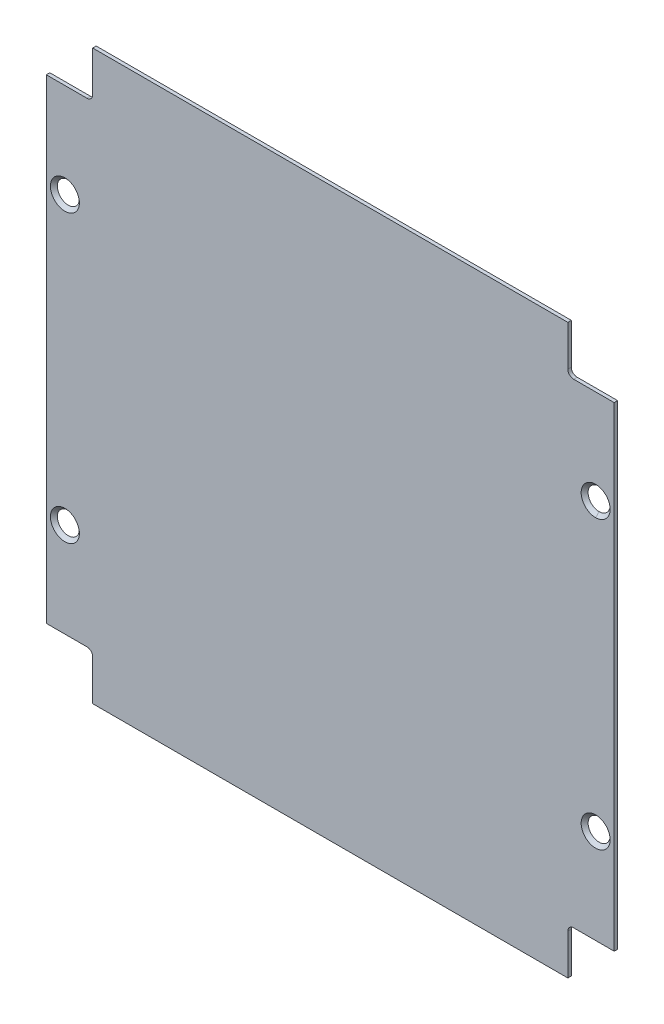
ISO-10303-21;
HEADER;
FILE_DESCRIPTION(('STEP AP214'),'2;1');
FILE_NAME('part.step','',(''),(''),'','','');
FILE_SCHEMA(('AUTOMOTIVE_DESIGN { 1 0 10303 214 1 1 1 1 }'));
ENDSEC;
DATA;
#1=APPLICATION_CONTEXT('core data for automotive mechanical design processes');
#2=APPLICATION_PROTOCOL_DEFINITION('international standard','automotive_design',2000,#1);
#3=PRODUCT_CONTEXT('',#1,'mechanical');
#4=PRODUCT('Part','Part','',(#3));
#5=PRODUCT_RELATED_PRODUCT_CATEGORY('part','',(#4));
#6=PRODUCT_DEFINITION_FORMATION('','',#4);
#7=PRODUCT_DEFINITION_CONTEXT('part definition',#1,'design');
#8=PRODUCT_DEFINITION('design','',#6,#7);
#9=PRODUCT_DEFINITION_SHAPE('','',#8);
#10=(LENGTH_UNIT() NAMED_UNIT(*) SI_UNIT(.MILLI.,.METRE.));
#11=(NAMED_UNIT(*) PLANE_ANGLE_UNIT() SI_UNIT($,.RADIAN.));
#12=(NAMED_UNIT(*) SI_UNIT($,.STERADIAN.) SOLID_ANGLE_UNIT());
#13=UNCERTAINTY_MEASURE_WITH_UNIT(LENGTH_MEASURE(1.E-05),#10,'distance_accuracy_value','');
#14=(GEOMETRIC_REPRESENTATION_CONTEXT(3) GLOBAL_UNCERTAINTY_ASSIGNED_CONTEXT((#13)) GLOBAL_UNIT_ASSIGNED_CONTEXT((#10,
#11,#12)) REPRESENTATION_CONTEXT('',''));
#15=CARTESIAN_POINT('',(0.,0.,0.));
#16=DIRECTION('',(0.,0.,1.));
#17=DIRECTION('',(1.,0.,0.));
#18=AXIS2_PLACEMENT_3D('',#15,#16,#17);
#19=CARTESIAN_POINT('',(50.,-50.,220.05));
#20=DIRECTION('',(0.,0.,1.));
#21=DIRECTION('',(1.,0.,0.));
#22=AXIS2_PLACEMENT_3D('',#19,#20,#21);
#23=PLANE('',#22);
#24=CARTESIAN_POINT('',(4.2,-25.3,220.05));
#25=DIRECTION('',(0.,0.,1.));
#26=DIRECTION('',(1.,0.,0.));
#27=AXIS2_PLACEMENT_3D('',#24,#25,#26);
#28=CIRCLE('',#27,2.50000738707188);
#29=CARTESIAN_POINT('',(6.70000738707188,-25.3,220.05));
#30=VERTEX_POINT('',#29);
#31=EDGE_CURVE('E171',#30,#30,#28,.F.);
#32=ORIENTED_EDGE('',*,*,#31,.T.);
#33=EDGE_LOOP('',(#32));
#34=FACE_BOUND('',#33,.T.);
#35=CARTESIAN_POINT('',(95.8,-25.3,220.05));
#36=DIRECTION('',(0.,0.,1.));
#37=DIRECTION('',(1.,0.,0.));
#38=AXIS2_PLACEMENT_3D('',#35,#36,#37);
#39=CIRCLE('',#38,2.50000738709999);
#40=CARTESIAN_POINT('',(95.8,-22.8000039421432,220.049994335381));
#41=VERTEX_POINT('',#40);
#42=CARTESIAN_POINT('',(95.8,-27.799996057862,220.049994335381));
#43=VERTEX_POINT('',#42);
#44=EDGE_CURVE('E182',#41,#43,#39,.F.);
#45=ORIENTED_EDGE('',*,*,#44,.T.);
#46=CARTESIAN_POINT('',(95.8,-25.3,220.05));
#47=DIRECTION('',(0.,0.,1.));
#48=DIRECTION('',(1.,0.,0.));
#49=AXIS2_PLACEMENT_3D('',#46,#47,#48);
#50=CIRCLE('',#49,2.50000738709999);
#51=EDGE_CURVE('E339',#43,#41,#50,.F.);
#52=ORIENTED_EDGE('',*,*,#51,.T.);
#53=EDGE_LOOP('',(#45,#52));
#54=FACE_BOUND('',#53,.T.);
#55=CARTESIAN_POINT('',(95.8,-74.7,220.05));
#56=DIRECTION('',(0.,0.,1.));
#57=DIRECTION('',(1.,0.,0.));
#58=AXIS2_PLACEMENT_3D('',#55,#56,#57);
#59=CIRCLE('',#58,2.50000738709999);
#60=CARTESIAN_POINT('',(98.3000073871,-74.7,220.05));
#61=VERTEX_POINT('',#60);
#62=EDGE_CURVE('E344',#61,#61,#59,.F.);
#63=ORIENTED_EDGE('',*,*,#62,.T.);
#64=EDGE_LOOP('',(#63));
#65=FACE_BOUND('',#64,.T.);
#66=CARTESIAN_POINT('',(4.2,-74.7,220.05));
#67=DIRECTION('',(0.,0.,1.));
#68=DIRECTION('',(1.,0.,0.));
#69=AXIS2_PLACEMENT_3D('',#66,#67,#68);
#70=CIRCLE('',#69,2.50000738707188);
#71=CARTESIAN_POINT('',(6.70000738707188,-74.7,220.05));
#72=VERTEX_POINT('',#71);
#73=EDGE_CURVE('E190',#72,#72,#70,.F.);
#74=ORIENTED_EDGE('',*,*,#73,.T.);
#75=EDGE_LOOP('',(#74));
#76=FACE_BOUND('',#75,.T.);
#77=DIRECTION('',(0.,1.,0.));
#78=VECTOR('',#77,1.);
#79=CARTESIAN_POINT('',(9.,-4.5,220.05));
#80=LINE('',#79,#78);
#81=CARTESIAN_POINT('',(9.,-1.,220.05));
#82=VERTEX_POINT('',#81);
#83=CARTESIAN_POINT('',(9.,-8.,220.05));
#84=VERTEX_POINT('',#83);
#85=EDGE_CURVE('E191',#82,#84,#80,.F.);
#86=ORIENTED_EDGE('',*,*,#85,.T.);
#87=CARTESIAN_POINT('',(8.,-8.,220.05));
#88=DIRECTION('',(0.,0.,1.));
#89=DIRECTION('',(1.,0.,0.));
#90=AXIS2_PLACEMENT_3D('',#87,#88,#89);
#91=CIRCLE('',#90,1.);
#92=CARTESIAN_POINT('',(8.,-9.,220.05));
#93=VERTEX_POINT('',#92);
#94=EDGE_CURVE('E20',#84,#93,#91,.F.);
#95=ORIENTED_EDGE('',*,*,#94,.T.);
#96=DIRECTION('',(1.,0.,0.));
#97=VECTOR('',#96,1.);
#98=CARTESIAN_POINT('',(4.5,-9.,220.05));
#99=LINE('',#98,#97);
#100=CARTESIAN_POINT('',(1.,-9.,220.05));
#101=VERTEX_POINT('',#100);
#102=EDGE_CURVE('E277',#101,#93,#99,.T.);
#103=ORIENTED_EDGE('',*,*,#102,.F.);
#104=DIRECTION('',(0.,1.,0.));
#105=VECTOR('',#104,1.);
#106=CARTESIAN_POINT('',(1.,-50.,220.05));
#107=LINE('',#106,#105);
#108=CARTESIAN_POINT('',(1.,-91.,220.05));
#109=VERTEX_POINT('',#108);
#110=EDGE_CURVE('E151',#101,#109,#107,.F.);
#111=ORIENTED_EDGE('',*,*,#110,.T.);
#112=DIRECTION('',(1.,0.,0.));
#113=VECTOR('',#112,1.);
#114=CARTESIAN_POINT('',(4.5,-91.,220.05));
#115=LINE('',#114,#113);
#116=CARTESIAN_POINT('',(8.,-91.,220.05));
#117=VERTEX_POINT('',#116);
#118=EDGE_CURVE('E267',#109,#117,#115,.T.);
#119=ORIENTED_EDGE('',*,*,#118,.T.);
#120=CARTESIAN_POINT('',(8.,-92.,220.05));
#121=DIRECTION('',(0.,0.,1.));
#122=DIRECTION('',(1.,0.,0.));
#123=AXIS2_PLACEMENT_3D('',#120,#121,#122);
#124=CIRCLE('',#123,1.);
#125=CARTESIAN_POINT('',(9.,-92.,220.05));
#126=VERTEX_POINT('',#125);
#127=EDGE_CURVE('E263',#117,#126,#124,.F.);
#128=ORIENTED_EDGE('',*,*,#127,.T.);
#129=DIRECTION('',(0.,1.,0.));
#130=VECTOR('',#129,1.);
#131=CARTESIAN_POINT('',(9.,-95.5,220.05));
#132=LINE('',#131,#130);
#133=CARTESIAN_POINT('',(9.,-99.,220.05));
#134=VERTEX_POINT('',#133);
#135=EDGE_CURVE('E257',#126,#134,#132,.F.);
#136=ORIENTED_EDGE('',*,*,#135,.T.);
#137=DIRECTION('',(1.,0.,0.));
#138=VECTOR('',#137,1.);
#139=CARTESIAN_POINT('',(50.,-99.,220.05));
#140=LINE('',#139,#138);
#141=CARTESIAN_POINT('',(91.,-99.,220.05));
#142=VERTEX_POINT('',#141);
#143=EDGE_CURVE('E256',#134,#142,#140,.T.);
#144=ORIENTED_EDGE('',*,*,#143,.T.);
#145=DIRECTION('',(0.,1.,0.));
#146=VECTOR('',#145,1.);
#147=CARTESIAN_POINT('',(91.,-95.5,220.05));
#148=LINE('',#147,#146);
#149=CARTESIAN_POINT('',(91.,-92.,220.05));
#150=VERTEX_POINT('',#149);
#151=EDGE_CURVE('E243',#150,#142,#148,.F.);
#152=ORIENTED_EDGE('',*,*,#151,.F.);
#153=CARTESIAN_POINT('',(92.,-92.,220.05));
#154=DIRECTION('',(0.,0.,1.));
#155=DIRECTION('',(1.,0.,0.));
#156=AXIS2_PLACEMENT_3D('',#153,#154,#155);
#157=CIRCLE('',#156,1.);
#158=CARTESIAN_POINT('',(92.,-91.,220.05));
#159=VERTEX_POINT('',#158);
#160=EDGE_CURVE('E237',#150,#159,#157,.F.);
#161=ORIENTED_EDGE('',*,*,#160,.T.);
#162=DIRECTION('',(1.,0.,0.));
#163=VECTOR('',#162,1.);
#164=CARTESIAN_POINT('',(95.5,-91.,220.05));
#165=LINE('',#164,#163);
#166=CARTESIAN_POINT('',(99.,-91.,220.05));
#167=VERTEX_POINT('',#166);
#168=EDGE_CURVE('E236',#159,#167,#165,.T.);
#169=ORIENTED_EDGE('',*,*,#168,.T.);
#170=DIRECTION('',(0.,1.,0.));
#171=VECTOR('',#170,1.);
#172=CARTESIAN_POINT('',(99.,-50.,220.05));
#173=LINE('',#172,#171);
#174=CARTESIAN_POINT('',(99.,-9.,220.05));
#175=VERTEX_POINT('',#174);
#176=EDGE_CURVE('E230',#175,#167,#173,.F.);
#177=ORIENTED_EDGE('',*,*,#176,.F.);
#178=DIRECTION('',(1.,0.,0.));
#179=VECTOR('',#178,1.);
#180=CARTESIAN_POINT('',(95.5,-9.,220.05));
#181=LINE('',#180,#179);
#182=CARTESIAN_POINT('',(92.,-9.,220.05));
#183=VERTEX_POINT('',#182);
#184=EDGE_CURVE('E218',#183,#175,#181,.T.);
#185=ORIENTED_EDGE('',*,*,#184,.F.);
#186=CARTESIAN_POINT('',(92.,-8.,220.05));
#187=DIRECTION('',(0.,0.,1.));
#188=DIRECTION('',(1.,0.,0.));
#189=AXIS2_PLACEMENT_3D('',#186,#187,#188);
#190=CIRCLE('',#189,1.);
#191=CARTESIAN_POINT('',(91.,-8.,220.05));
#192=VERTEX_POINT('',#191);
#193=EDGE_CURVE('E215',#183,#192,#190,.F.);
#194=ORIENTED_EDGE('',*,*,#193,.T.);
#195=DIRECTION('',(0.,1.,0.));
#196=VECTOR('',#195,1.);
#197=CARTESIAN_POINT('',(91.,-4.5,220.05));
#198=LINE('',#197,#196);
#199=CARTESIAN_POINT('',(91.,-1.,220.05));
#200=VERTEX_POINT('',#199);
#201=EDGE_CURVE('E211',#200,#192,#198,.F.);
#202=ORIENTED_EDGE('',*,*,#201,.F.);
#203=DIRECTION('',(1.,0.,0.));
#204=VECTOR('',#203,1.);
#205=CARTESIAN_POINT('',(50.,-1.,220.05));
#206=LINE('',#205,#204);
#207=EDGE_CURVE('E116',#82,#200,#206,.T.);
#208=ORIENTED_EDGE('',*,*,#207,.F.);
#209=EDGE_LOOP('',(#86,#95,#103,#111,#119,#128,#136,#144,#152,#161,#169,#177,#185,#194,#202,#208));
#210=FACE_BOUND('',#209,.T.);
#211=ADVANCED_FACE('F17',(#34,#54,#65,#76,#210),#23,.T.);
#212=CARTESIAN_POINT('',(8.,-8.,219.2836869265));
#213=DIRECTION('',(0.,0.,1.));
#214=DIRECTION('',(1.,0.,0.));
#215=AXIS2_PLACEMENT_3D('',#212,#213,#214);
#216=CYLINDRICAL_SURFACE('',#215,1.);
#217=ORIENTED_EDGE('',*,*,#94,.F.);
#218=DIRECTION('',(0.,0.,-1.));
#219=VECTOR('',#218,1.);
#220=CARTESIAN_POINT('',(9.,-8.,219.75));
#221=LINE('',#220,#219);
#222=CARTESIAN_POINT('',(9.,-8.,219.45));
#223=VERTEX_POINT('',#222);
#224=EDGE_CURVE('E188',#84,#223,#221,.T.);
#225=ORIENTED_EDGE('',*,*,#224,.T.);
#226=CARTESIAN_POINT('',(8.,-8.,219.45));
#227=DIRECTION('',(0.,0.,1.));
#228=DIRECTION('',(1.,0.,0.));
#229=AXIS2_PLACEMENT_3D('',#226,#227,#228);
#230=CIRCLE('',#229,1.);
#231=CARTESIAN_POINT('',(8.,-9.,219.45));
#232=VERTEX_POINT('',#231);
#233=EDGE_CURVE('E169',#223,#232,#230,.F.);
#234=ORIENTED_EDGE('',*,*,#233,.T.);
#235=DIRECTION('',(0.,0.,1.));
#236=VECTOR('',#235,1.);
#237=CARTESIAN_POINT('',(8.,-9.,219.75));
#238=LINE('',#237,#236);
#239=EDGE_CURVE('E155',#93,#232,#238,.F.);
#240=ORIENTED_EDGE('',*,*,#239,.F.);
#241=EDGE_LOOP('',(#217,#225,#234,#240));
#242=FACE_BOUND('',#241,.T.);
#243=ADVANCED_FACE('F613',(#242),#216,.F.);
#244=CARTESIAN_POINT('',(4.5,-9.,219.75));
#245=DIRECTION('',(0.,1.,0.));
#246=DIRECTION('',(0.,0.,1.));
#247=AXIS2_PLACEMENT_3D('',#244,#245,#246);
#248=PLANE('',#247);
#249=ORIENTED_EDGE('',*,*,#239,.T.);
#250=DIRECTION('',(1.,0.,0.));
#251=VECTOR('',#250,1.);
#252=CARTESIAN_POINT('',(50.,-9.,219.45));
#253=LINE('',#252,#251);
#254=CARTESIAN_POINT('',(1.,-9.,219.45));
#255=VERTEX_POINT('',#254);
#256=EDGE_CURVE('E162',#232,#255,#253,.F.);
#257=ORIENTED_EDGE('',*,*,#256,.T.);
#258=DIRECTION('',(0.,0.,-1.));
#259=VECTOR('',#258,1.);
#260=CARTESIAN_POINT('',(1.,-9.,219.75));
#261=LINE('',#260,#259);
#262=EDGE_CURVE('E146',#255,#101,#261,.F.);
#263=ORIENTED_EDGE('',*,*,#262,.T.);
#264=ORIENTED_EDGE('',*,*,#102,.T.);
#265=EDGE_LOOP('',(#249,#257,#263,#264));
#266=FACE_BOUND('',#265,.T.);
#267=ADVANCED_FACE('F168',(#266),#248,.T.);
#268=CARTESIAN_POINT('',(1.,-50.,219.75));
#269=DIRECTION('',(1.,0.,0.));
#270=DIRECTION('',(0.,0.,-1.));
#271=AXIS2_PLACEMENT_3D('',#268,#269,#270);
#272=PLANE('',#271);
#273=DIRECTION('',(0.,0.,1.));
#274=VECTOR('',#273,1.);
#275=CARTESIAN_POINT('',(1.,-91.,219.75));
#276=LINE('',#275,#274);
#277=CARTESIAN_POINT('',(1.,-91.,219.45));
#278=VERTEX_POINT('',#277);
#279=EDGE_CURVE('E268',#278,#109,#276,.T.);
#280=ORIENTED_EDGE('',*,*,#279,.T.);
#281=ORIENTED_EDGE('',*,*,#110,.F.);
#282=ORIENTED_EDGE('',*,*,#262,.F.);
#283=DIRECTION('',(0.,1.,0.));
#284=VECTOR('',#283,1.);
#285=CARTESIAN_POINT('',(1.,-50.,219.45));
#286=LINE('',#285,#284);
#287=EDGE_CURVE('E150',#255,#278,#286,.F.);
#288=ORIENTED_EDGE('',*,*,#287,.T.);
#289=EDGE_LOOP('',(#280,#281,#282,#288));
#290=FACE_BOUND('',#289,.T.);
#291=ADVANCED_FACE('F149',(#290),#272,.F.);
#292=CARTESIAN_POINT('',(4.5,-91.,219.75));
#293=DIRECTION('',(0.,1.,0.));
#294=DIRECTION('',(0.,0.,1.));
#295=AXIS2_PLACEMENT_3D('',#292,#293,#294);
#296=PLANE('',#295);
#297=ORIENTED_EDGE('',*,*,#118,.F.);
#298=ORIENTED_EDGE('',*,*,#279,.F.);
#299=DIRECTION('',(1.,0.,0.));
#300=VECTOR('',#299,1.);
#301=CARTESIAN_POINT('',(50.,-91.,219.45));
#302=LINE('',#301,#300);
#303=CARTESIAN_POINT('',(8.,-91.,219.45));
#304=VERTEX_POINT('',#303);
#305=EDGE_CURVE('E166',#278,#304,#302,.T.);
#306=ORIENTED_EDGE('',*,*,#305,.T.);
#307=DIRECTION('',(0.,0.,1.));
#308=VECTOR('',#307,1.);
#309=CARTESIAN_POINT('',(8.,-91.,219.2836869265));
#310=LINE('',#309,#308);
#311=EDGE_CURVE('E264',#304,#117,#310,.T.);
#312=ORIENTED_EDGE('',*,*,#311,.T.);
#313=EDGE_LOOP('',(#297,#298,#306,#312));
#314=FACE_BOUND('',#313,.T.);
#315=ADVANCED_FACE('F369',(#314),#296,.F.);
#316=CARTESIAN_POINT('',(8.,-92.,219.2836869265));
#317=DIRECTION('',(0.,0.,1.));
#318=DIRECTION('',(1.,0.,0.));
#319=AXIS2_PLACEMENT_3D('',#316,#317,#318);
#320=CYLINDRICAL_SURFACE('',#319,1.);
#321=ORIENTED_EDGE('',*,*,#127,.F.);
#322=ORIENTED_EDGE('',*,*,#311,.F.);
#323=CARTESIAN_POINT('',(8.,-92.,219.45));
#324=DIRECTION('',(0.,0.,1.));
#325=DIRECTION('',(1.,0.,0.));
#326=AXIS2_PLACEMENT_3D('',#323,#324,#325);
#327=CIRCLE('',#326,1.);
#328=CARTESIAN_POINT('',(9.,-92.,219.45));
#329=VERTEX_POINT('',#328);
#330=EDGE_CURVE('E330',#304,#329,#327,.F.);
#331=ORIENTED_EDGE('',*,*,#330,.T.);
#332=DIRECTION('',(0.,0.,-1.));
#333=VECTOR('',#332,1.);
#334=CARTESIAN_POINT('',(9.,-92.,219.75));
#335=LINE('',#334,#333);
#336=EDGE_CURVE('E260',#329,#126,#335,.F.);
#337=ORIENTED_EDGE('',*,*,#336,.T.);
#338=EDGE_LOOP('',(#321,#322,#331,#337));
#339=FACE_BOUND('',#338,.T.);
#340=ADVANCED_FACE('F366',(#339),#320,.F.);
#341=CARTESIAN_POINT('',(9.,-95.5,219.75));
#342=DIRECTION('',(1.,0.,0.));
#343=DIRECTION('',(0.,0.,-1.));
#344=AXIS2_PLACEMENT_3D('',#341,#342,#343);
#345=PLANE('',#344);
#346=ORIENTED_EDGE('',*,*,#135,.F.);
#347=ORIENTED_EDGE('',*,*,#336,.F.);
#348=DIRECTION('',(0.,1.,0.));
#349=VECTOR('',#348,1.);
#350=CARTESIAN_POINT('',(9.,-50.,219.45));
#351=LINE('',#350,#349);
#352=CARTESIAN_POINT('',(9.,-99.,219.45));
#353=VERTEX_POINT('',#352);
#354=EDGE_CURVE('E250',#329,#353,#351,.F.);
#355=ORIENTED_EDGE('',*,*,#354,.T.);
#356=DIRECTION('',(0.,0.,1.));
#357=VECTOR('',#356,1.);
#358=CARTESIAN_POINT('',(9.,-99.,219.75));
#359=LINE('',#358,#357);
#360=EDGE_CURVE('E253',#353,#134,#359,.T.);
#361=ORIENTED_EDGE('',*,*,#360,.T.);
#362=EDGE_LOOP('',(#346,#347,#355,#361));
#363=FACE_BOUND('',#362,.T.);
#364=ADVANCED_FACE('F363',(#363),#345,.F.);
#365=CARTESIAN_POINT('',(50.,-99.,219.75));
#366=DIRECTION('',(0.,1.,0.));
#367=DIRECTION('',(0.,0.,1.));
#368=AXIS2_PLACEMENT_3D('',#365,#366,#367);
#369=PLANE('',#368);
#370=DIRECTION('',(0.,0.,-1.));
#371=VECTOR('',#370,1.);
#372=CARTESIAN_POINT('',(91.,-99.,219.75));
#373=LINE('',#372,#371);
#374=CARTESIAN_POINT('',(91.,-99.,219.45));
#375=VERTEX_POINT('',#374);
#376=EDGE_CURVE('E241',#142,#375,#373,.T.);
#377=ORIENTED_EDGE('',*,*,#376,.F.);
#378=ORIENTED_EDGE('',*,*,#143,.F.);
#379=ORIENTED_EDGE('',*,*,#360,.F.);
#380=DIRECTION('',(1.,0.,0.));
#381=VECTOR('',#380,1.);
#382=CARTESIAN_POINT('',(50.,-99.,219.45));
#383=LINE('',#382,#381);
#384=EDGE_CURVE('E246',#353,#375,#383,.T.);
#385=ORIENTED_EDGE('',*,*,#384,.T.);
#386=EDGE_LOOP('',(#377,#378,#379,#385));
#387=FACE_BOUND('',#386,.T.);
#388=ADVANCED_FACE('F430',(#387),#369,.F.);
#389=CARTESIAN_POINT('',(91.,-95.5,219.75));
#390=DIRECTION('',(1.,0.,0.));
#391=DIRECTION('',(0.,0.,-1.));
#392=AXIS2_PLACEMENT_3D('',#389,#390,#391);
#393=PLANE('',#392);
#394=ORIENTED_EDGE('',*,*,#376,.T.);
#395=DIRECTION('',(0.,1.,0.));
#396=VECTOR('',#395,1.);
#397=CARTESIAN_POINT('',(91.,-50.,219.45));
#398=LINE('',#397,#396);
#399=CARTESIAN_POINT('',(91.,-92.,219.45));
#400=VERTEX_POINT('',#399);
#401=EDGE_CURVE('E249',#375,#400,#398,.T.);
#402=ORIENTED_EDGE('',*,*,#401,.T.);
#403=DIRECTION('',(0.,0.,1.));
#404=VECTOR('',#403,1.);
#405=CARTESIAN_POINT('',(91.,-92.,219.2836869266));
#406=LINE('',#405,#404);
#407=EDGE_CURVE('E238',#400,#150,#406,.T.);
#408=ORIENTED_EDGE('',*,*,#407,.T.);
#409=ORIENTED_EDGE('',*,*,#151,.T.);
#410=EDGE_LOOP('',(#394,#402,#408,#409));
#411=FACE_BOUND('',#410,.T.);
#412=ADVANCED_FACE('F427',(#411),#393,.T.);
#413=CARTESIAN_POINT('',(92.,-92.,219.2836869266));
#414=DIRECTION('',(0.,0.,1.));
#415=DIRECTION('',(1.,0.,0.));
#416=AXIS2_PLACEMENT_3D('',#413,#414,#415);
#417=CYLINDRICAL_SURFACE('',#416,1.);
#418=ORIENTED_EDGE('',*,*,#160,.F.);
#419=ORIENTED_EDGE('',*,*,#407,.F.);
#420=CARTESIAN_POINT('',(92.,-92.,219.45));
#421=DIRECTION('',(0.,0.,1.));
#422=DIRECTION('',(1.,0.,0.));
#423=AXIS2_PLACEMENT_3D('',#420,#421,#422);
#424=CIRCLE('',#423,1.);
#425=CARTESIAN_POINT('',(92.,-91.,219.45));
#426=VERTEX_POINT('',#425);
#427=EDGE_CURVE('E327',#400,#426,#424,.F.);
#428=ORIENTED_EDGE('',*,*,#427,.T.);
#429=DIRECTION('',(0.,0.,1.));
#430=VECTOR('',#429,1.);
#431=CARTESIAN_POINT('',(92.,-91.,219.75));
#432=LINE('',#431,#430);
#433=EDGE_CURVE('E233',#426,#159,#432,.T.);
#434=ORIENTED_EDGE('',*,*,#433,.T.);
#435=EDGE_LOOP('',(#418,#419,#428,#434));
#436=FACE_BOUND('',#435,.T.);
#437=ADVANCED_FACE('F425',(#436),#417,.F.);
#438=CARTESIAN_POINT('',(95.5,-91.,219.75));
#439=DIRECTION('',(0.,1.,0.));
#440=DIRECTION('',(0.,0.,1.));
#441=AXIS2_PLACEMENT_3D('',#438,#439,#440);
#442=PLANE('',#441);
#443=ORIENTED_EDGE('',*,*,#168,.F.);
#444=ORIENTED_EDGE('',*,*,#433,.F.);
#445=DIRECTION('',(1.,0.,0.));
#446=VECTOR('',#445,1.);
#447=CARTESIAN_POINT('',(50.,-91.,219.45));
#448=LINE('',#447,#446);
#449=CARTESIAN_POINT('',(99.,-91.,219.45));
#450=VERTEX_POINT('',#449);
#451=EDGE_CURVE('E225',#426,#450,#448,.T.);
#452=ORIENTED_EDGE('',*,*,#451,.T.);
#453=DIRECTION('',(0.,0.,-1.));
#454=VECTOR('',#453,1.);
#455=CARTESIAN_POINT('',(99.,-91.,219.75));
#456=LINE('',#455,#454);
#457=EDGE_CURVE('E228',#167,#450,#456,.T.);
#458=ORIENTED_EDGE('',*,*,#457,.F.);
#459=EDGE_LOOP('',(#443,#444,#452,#458));
#460=FACE_BOUND('',#459,.T.);
#461=ADVANCED_FACE('F420',(#460),#442,.F.);
#462=CARTESIAN_POINT('',(99.,-50.,219.75));
#463=DIRECTION('',(1.,0.,0.));
#464=DIRECTION('',(0.,0.,-1.));
#465=AXIS2_PLACEMENT_3D('',#462,#463,#464);
#466=PLANE('',#465);
#467=DIRECTION('',(0.,1.,0.));
#468=VECTOR('',#467,1.);
#469=CARTESIAN_POINT('',(99.,-50.,219.45));
#470=LINE('',#469,#468);
#471=CARTESIAN_POINT('',(99.,-9.,219.45));
#472=VERTEX_POINT('',#471);
#473=EDGE_CURVE('E221',#450,#472,#470,.T.);
#474=ORIENTED_EDGE('',*,*,#473,.T.);
#475=DIRECTION('',(0.,0.,1.));
#476=VECTOR('',#475,1.);
#477=CARTESIAN_POINT('',(99.,-9.,219.75));
#478=LINE('',#477,#476);
#479=EDGE_CURVE('E216',#175,#472,#478,.F.);
#480=ORIENTED_EDGE('',*,*,#479,.F.);
#481=ORIENTED_EDGE('',*,*,#176,.T.);
#482=ORIENTED_EDGE('',*,*,#457,.T.);
#483=EDGE_LOOP('',(#474,#480,#481,#482));
#484=FACE_BOUND('',#483,.T.);
#485=ADVANCED_FACE('F416',(#484),#466,.T.);
#486=CARTESIAN_POINT('',(95.5,-9.,219.75));
#487=DIRECTION('',(0.,1.,0.));
#488=DIRECTION('',(0.,0.,1.));
#489=AXIS2_PLACEMENT_3D('',#486,#487,#488);
#490=PLANE('',#489);
#491=ORIENTED_EDGE('',*,*,#479,.T.);
#492=DIRECTION('',(1.,0.,0.));
#493=VECTOR('',#492,1.);
#494=CARTESIAN_POINT('',(50.,-9.,219.45));
#495=LINE('',#494,#493);
#496=CARTESIAN_POINT('',(92.,-9.,219.45));
#497=VERTEX_POINT('',#496);
#498=EDGE_CURVE('E224',#472,#497,#495,.F.);
#499=ORIENTED_EDGE('',*,*,#498,.T.);
#500=DIRECTION('',(0.,0.,1.));
#501=VECTOR('',#500,1.);
#502=CARTESIAN_POINT('',(92.,-9.,219.2836869266));
#503=LINE('',#502,#501);
#504=EDGE_CURVE('E212',#497,#183,#503,.T.);
#505=ORIENTED_EDGE('',*,*,#504,.T.);
#506=ORIENTED_EDGE('',*,*,#184,.T.);
#507=EDGE_LOOP('',(#491,#499,#505,#506));
#508=FACE_BOUND('',#507,.T.);
#509=ADVANCED_FACE('F410',(#508),#490,.T.);
#510=CARTESIAN_POINT('',(92.,-8.,219.2836869266));
#511=DIRECTION('',(0.,0.,1.));
#512=DIRECTION('',(1.,0.,0.));
#513=AXIS2_PLACEMENT_3D('',#510,#511,#512);
#514=CYLINDRICAL_SURFACE('',#513,1.);
#515=ORIENTED_EDGE('',*,*,#193,.F.);
#516=ORIENTED_EDGE('',*,*,#504,.F.);
#517=CARTESIAN_POINT('',(92.,-8.,219.45));
#518=DIRECTION('',(0.,0.,1.));
#519=DIRECTION('',(1.,0.,0.));
#520=AXIS2_PLACEMENT_3D('',#517,#518,#519);
#521=CIRCLE('',#520,1.);
#522=CARTESIAN_POINT('',(91.,-8.,219.45));
#523=VERTEX_POINT('',#522);
#524=EDGE_CURVE('E324',#497,#523,#521,.F.);
#525=ORIENTED_EDGE('',*,*,#524,.T.);
#526=DIRECTION('',(0.,0.,-1.));
#527=VECTOR('',#526,1.);
#528=CARTESIAN_POINT('',(91.,-8.,219.75));
#529=LINE('',#528,#527);
#530=EDGE_CURVE('E209',#192,#523,#529,.T.);
#531=ORIENTED_EDGE('',*,*,#530,.F.);
#532=EDGE_LOOP('',(#515,#516,#525,#531));
#533=FACE_BOUND('',#532,.T.);
#534=ADVANCED_FACE('F408',(#533),#514,.F.);
#535=CARTESIAN_POINT('',(91.,-4.5,219.75));
#536=DIRECTION('',(1.,0.,0.));
#537=DIRECTION('',(0.,0.,-1.));
#538=AXIS2_PLACEMENT_3D('',#535,#536,#537);
#539=PLANE('',#538);
#540=ORIENTED_EDGE('',*,*,#530,.T.);
#541=DIRECTION('',(0.,1.,0.));
#542=VECTOR('',#541,1.);
#543=CARTESIAN_POINT('',(91.,-50.,219.45));
#544=LINE('',#543,#542);
#545=CARTESIAN_POINT('',(91.,-1.,219.45));
#546=VERTEX_POINT('',#545);
#547=EDGE_CURVE('E202',#523,#546,#544,.T.);
#548=ORIENTED_EDGE('',*,*,#547,.T.);
#549=DIRECTION('',(0.,0.,1.));
#550=VECTOR('',#549,1.);
#551=CARTESIAN_POINT('',(91.,-1.,219.75));
#552=LINE('',#551,#550);
#553=EDGE_CURVE('E195',#200,#546,#552,.F.);
#554=ORIENTED_EDGE('',*,*,#553,.F.);
#555=ORIENTED_EDGE('',*,*,#201,.T.);
#556=EDGE_LOOP('',(#540,#548,#554,#555));
#557=FACE_BOUND('',#556,.T.);
#558=ADVANCED_FACE('F402',(#557),#539,.T.);
#559=CARTESIAN_POINT('',(50.,-1.,219.75));
#560=DIRECTION('',(0.,1.,0.));
#561=DIRECTION('',(0.,0.,1.));
#562=AXIS2_PLACEMENT_3D('',#559,#560,#561);
#563=PLANE('',#562);
#564=DIRECTION('',(1.,0.,0.));
#565=VECTOR('',#564,1.);
#566=CARTESIAN_POINT('',(50.,-1.,219.45));
#567=LINE('',#566,#565);
#568=CARTESIAN_POINT('',(9.,-1.,219.45));
#569=VERTEX_POINT('',#568);
#570=EDGE_CURVE('E198',#546,#569,#567,.F.);
#571=ORIENTED_EDGE('',*,*,#570,.T.);
#572=DIRECTION('',(0.,0.,-1.));
#573=VECTOR('',#572,1.);
#574=CARTESIAN_POINT('',(9.,-1.,219.75));
#575=LINE('',#574,#573);
#576=EDGE_CURVE('E192',#569,#82,#575,.F.);
#577=ORIENTED_EDGE('',*,*,#576,.T.);
#578=ORIENTED_EDGE('',*,*,#207,.T.);
#579=ORIENTED_EDGE('',*,*,#553,.T.);
#580=EDGE_LOOP('',(#571,#577,#578,#579));
#581=FACE_BOUND('',#580,.T.);
#582=ADVANCED_FACE('F399',(#581),#563,.T.);
#583=CARTESIAN_POINT('',(9.,-4.5,219.75));
#584=DIRECTION('',(1.,0.,0.));
#585=DIRECTION('',(0.,0.,-1.));
#586=AXIS2_PLACEMENT_3D('',#583,#584,#585);
#587=PLANE('',#586);
#588=ORIENTED_EDGE('',*,*,#85,.F.);
#589=ORIENTED_EDGE('',*,*,#576,.F.);
#590=DIRECTION('',(0.,1.,0.));
#591=VECTOR('',#590,1.);
#592=CARTESIAN_POINT('',(9.,-50.,219.45));
#593=LINE('',#592,#591);
#594=EDGE_CURVE('E201',#569,#223,#593,.F.);
#595=ORIENTED_EDGE('',*,*,#594,.T.);
#596=ORIENTED_EDGE('',*,*,#224,.F.);
#597=EDGE_LOOP('',(#588,#589,#595,#596));
#598=FACE_BOUND('',#597,.T.);
#599=ADVANCED_FACE('F396',(#598),#587,.F.);
#600=CARTESIAN_POINT('',(4.2,-74.7,220.049988670837));
#601=DIRECTION('',(0.,0.,1.));
#602=DIRECTION('',(1.,0.,0.));
#603=AXIS2_PLACEMENT_3D('',#600,#601,#602);
#604=CONICAL_SURFACE('',#603,2.49999605787552,0.785399640783618);
#605=CARTESIAN_POINT('',(4.2,-74.7,219.449999999995));
#606=DIRECTION('',(0.,0.,1.));
#607=DIRECTION('',(1.,0.,0.));
#608=AXIS2_PLACEMENT_3D('',#605,#606,#607);
#609=CIRCLE('',#608,1.90000561420065);
#610=CARTESIAN_POINT('',(6.10000561420065,-74.7,219.449999999995));
#611=VERTEX_POINT('',#610);
#612=EDGE_CURVE('E321',#611,#611,#609,.F.);
#613=ORIENTED_EDGE('',*,*,#612,.T.);
#614=EDGE_LOOP('',(#613));
#615=FACE_BOUND('',#614,.T.);
#616=ORIENTED_EDGE('',*,*,#73,.F.);
#617=EDGE_LOOP('',(#616));
#618=FACE_BOUND('',#617,.T.);
#619=ADVANCED_FACE('F462',(#615,#618),#604,.F.);
#620=CARTESIAN_POINT('',(95.8,-74.7,220.049988670723));
#621=DIRECTION('',(0.,0.,1.));
#622=DIRECTION('',(1.,0.,0.));
#623=AXIS2_PLACEMENT_3D('',#620,#621,#622);
#624=CONICAL_SURFACE('',#623,2.49999605778994,0.785399640783618);
#625=CARTESIAN_POINT('',(95.8,-74.7,219.449999999938));
#626=DIRECTION('',(0.,0.,1.));
#627=DIRECTION('',(1.,0.,0.));
#628=AXIS2_PLACEMENT_3D('',#625,#626,#627);
#629=CIRCLE('',#628,1.90000561417192);
#630=CARTESIAN_POINT('',(97.7000056141719,-74.7,219.449999999938));
#631=VERTEX_POINT('',#630);
#632=EDGE_CURVE('E318',#631,#631,#629,.F.);
#633=ORIENTED_EDGE('',*,*,#632,.T.);
#634=EDGE_LOOP('',(#633));
#635=FACE_BOUND('',#634,.T.);
#636=ORIENTED_EDGE('',*,*,#62,.F.);
#637=EDGE_LOOP('',(#636));
#638=FACE_BOUND('',#637,.T.);
#639=ADVANCED_FACE('F459',(#635,#638),#624,.F.);
#640=CARTESIAN_POINT('',(95.8,-25.3,220.049988670723));
#641=DIRECTION('',(0.,0.,1.));
#642=DIRECTION('',(1.,0.,0.));
#643=AXIS2_PLACEMENT_3D('',#640,#641,#642);
#644=CONICAL_SURFACE('',#643,2.49999605778994,0.785399640783618);
#645=CARTESIAN_POINT('',(95.8,-25.3,219.449999999938));
#646=DIRECTION('',(0.,0.,1.));
#647=DIRECTION('',(1.,0.,0.));
#648=AXIS2_PLACEMENT_3D('',#645,#646,#647);
#649=CIRCLE('',#648,1.90000561417192);
#650=CARTESIAN_POINT('',(95.8,-27.2000056142033,219.450000000025));
#651=VERTEX_POINT('',#650);
#652=CARTESIAN_POINT('',(95.8,-23.3999943857967,219.450000000025));
#653=VERTEX_POINT('',#652);
#654=EDGE_CURVE('E35',#651,#653,#649,.F.);
#655=ORIENTED_EDGE('',*,*,#654,.T.);
#656=DIRECTION('',(0.,-0.707107825871714,-0.707105736499838));
#657=VECTOR('',#656,1.);
#658=CARTESIAN_POINT('',(95.8000000000305,498758.623813561,499000.));
#659=LINE('',#658,#657);
#660=EDGE_CURVE('E181',#653,#41,#659,.F.);
#661=ORIENTED_EDGE('',*,*,#660,.T.);
#662=ORIENTED_EDGE('',*,*,#51,.F.);
#663=DIRECTION('',(0.,0.707107825871714,-0.707105736499838));
#664=VECTOR('',#663,1.);
#665=CARTESIAN_POINT('',(95.7999999999084,-498809.223813561,499000.));
#666=LINE('',#665,#664);
#667=EDGE_CURVE('E179',#43,#651,#666,.T.);
#668=ORIENTED_EDGE('',*,*,#667,.T.);
#669=EDGE_LOOP('',(#655,#661,#662,#668));
#670=FACE_BOUND('',#669,.T.);
#671=ADVANCED_FACE('F455',(#670),#644,.F.);
#672=CARTESIAN_POINT('',(95.8,-25.3,220.049988670667));
#673=DIRECTION('',(0.,0.,1.));
#674=DIRECTION('',(1.,0.,0.));
#675=AXIS2_PLACEMENT_3D('',#672,#673,#674);
#676=CONICAL_SURFACE('',#675,2.4999960577331,0.785399640830988);
#677=CARTESIAN_POINT('',(95.8,-25.3,219.450000000052));
#678=DIRECTION('',(0.,0.,1.));
#679=DIRECTION('',(1.,0.,0.));
#680=AXIS2_PLACEMENT_3D('',#677,#678,#679);
#681=CIRCLE('',#680,1.90000561422876);
#682=EDGE_CURVE('E26',#653,#651,#681,.F.);
#683=ORIENTED_EDGE('',*,*,#682,.T.);
#684=ORIENTED_EDGE('',*,*,#667,.F.);
#685=ORIENTED_EDGE('',*,*,#44,.F.);
#686=ORIENTED_EDGE('',*,*,#660,.F.);
#687=EDGE_LOOP('',(#683,#684,#685,#686));
#688=FACE_BOUND('',#687,.T.);
#689=ADVANCED_FACE('F447',(#688),#676,.F.);
#690=CARTESIAN_POINT('',(4.2,-25.3,220.049988670837));
#691=DIRECTION('',(0.,0.,1.));
#692=DIRECTION('',(1.,0.,0.));
#693=AXIS2_PLACEMENT_3D('',#690,#691,#692);
#694=CONICAL_SURFACE('',#693,2.49999605787552,0.785399640783618);
#695=CARTESIAN_POINT('',(4.2,-25.3,219.449999999995));
#696=DIRECTION('',(0.,0.,1.));
#697=DIRECTION('',(1.,0.,0.));
#698=AXIS2_PLACEMENT_3D('',#695,#696,#697);
#699=CIRCLE('',#698,1.90000561420065);
#700=CARTESIAN_POINT('',(6.10000561420065,-25.3,219.449999999995));
#701=VERTEX_POINT('',#700);
#702=EDGE_CURVE('E11',#701,#701,#699,.F.);
#703=ORIENTED_EDGE('',*,*,#702,.T.);
#704=EDGE_LOOP('',(#703));
#705=FACE_BOUND('',#704,.T.);
#706=ORIENTED_EDGE('',*,*,#31,.F.);
#707=EDGE_LOOP('',(#706));
#708=FACE_BOUND('',#707,.T.);
#709=ADVANCED_FACE('F441',(#705,#708),#694,.F.);
#710=CARTESIAN_POINT('',(50.,-50.,219.45));
#711=DIRECTION('',(0.,0.,1.));
#712=DIRECTION('',(1.,0.,0.));
#713=AXIS2_PLACEMENT_3D('',#710,#711,#712);
#714=PLANE('',#713);
#715=ORIENTED_EDGE('',*,*,#702,.F.);
#716=EDGE_LOOP('',(#715));
#717=FACE_BOUND('',#716,.T.);
#718=ORIENTED_EDGE('',*,*,#682,.F.);
#719=ORIENTED_EDGE('',*,*,#654,.F.);
#720=EDGE_LOOP('',(#718,#719));
#721=FACE_BOUND('',#720,.T.);
#722=ORIENTED_EDGE('',*,*,#632,.F.);
#723=EDGE_LOOP('',(#722));
#724=FACE_BOUND('',#723,.T.);
#725=ORIENTED_EDGE('',*,*,#612,.F.);
#726=EDGE_LOOP('',(#725));
#727=FACE_BOUND('',#726,.T.);
#728=ORIENTED_EDGE('',*,*,#570,.F.);
#729=ORIENTED_EDGE('',*,*,#547,.F.);
#730=ORIENTED_EDGE('',*,*,#524,.F.);
#731=ORIENTED_EDGE('',*,*,#498,.F.);
#732=ORIENTED_EDGE('',*,*,#473,.F.);
#733=ORIENTED_EDGE('',*,*,#451,.F.);
#734=ORIENTED_EDGE('',*,*,#427,.F.);
#735=ORIENTED_EDGE('',*,*,#401,.F.);
#736=ORIENTED_EDGE('',*,*,#384,.F.);
#737=ORIENTED_EDGE('',*,*,#354,.F.);
#738=ORIENTED_EDGE('',*,*,#330,.F.);
#739=ORIENTED_EDGE('',*,*,#305,.F.);
#740=ORIENTED_EDGE('',*,*,#287,.F.);
#741=ORIENTED_EDGE('',*,*,#256,.F.);
#742=ORIENTED_EDGE('',*,*,#233,.F.);
#743=ORIENTED_EDGE('',*,*,#594,.F.);
#744=EDGE_LOOP('',(#728,#729,#730,#731,#732,#733,#734,#735,#736,#737,#738,#739,#740,#741,#742,#743));
#745=FACE_BOUND('',#744,.T.);
#746=ADVANCED_FACE('F161',(#717,#721,#724,#727,#745),#714,.F.);
#747=CLOSED_SHELL('',(#211,#243,#267,#291,#315,#340,#364,#388,#412,#437,#461,#485,#509,#534,
#558,#582,#599,#619,#639,#671,#689,#709,#746));
#748=MANIFOLD_SOLID_BREP('B1',#747);
#749=ADVANCED_BREP_SHAPE_REPRESENTATION('',(#18,#748),#14);
#750=SHAPE_DEFINITION_REPRESENTATION(#9,#749);
ENDSEC;
END-ISO-10303-21;
